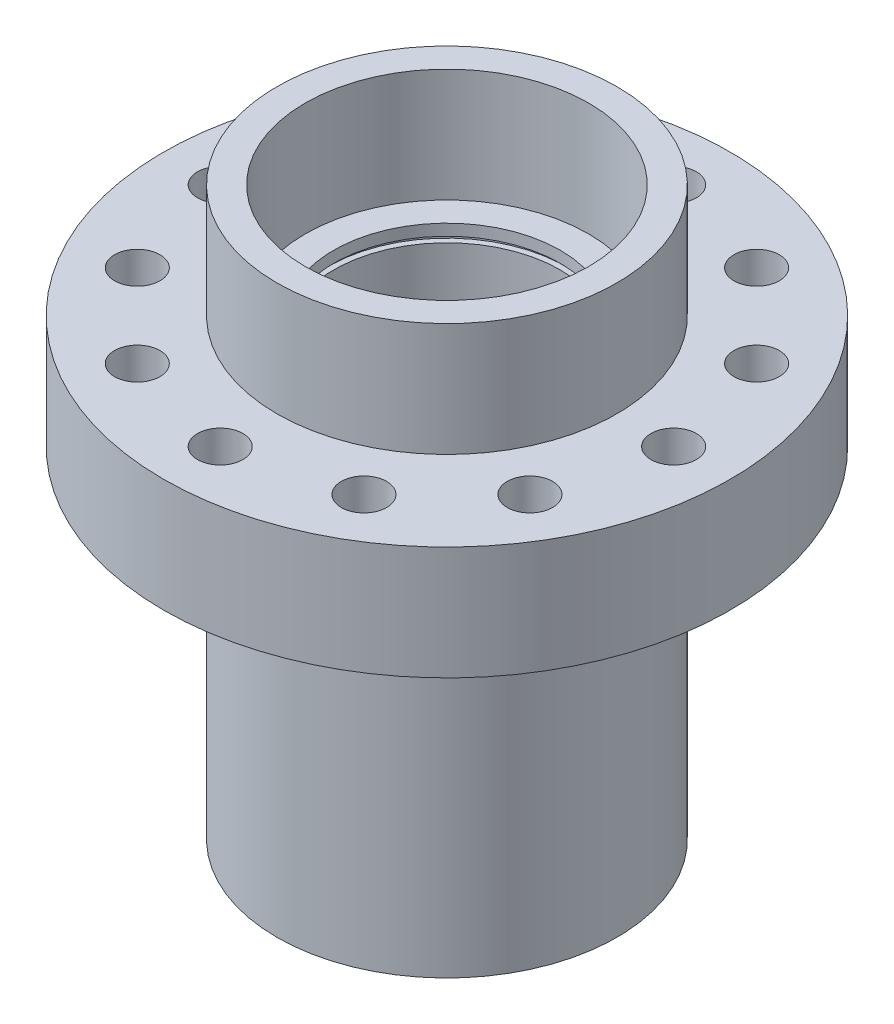
ISO-10303-21;
HEADER;
FILE_DESCRIPTION(('STEP AP214'),'2;1');
FILE_NAME('part.step','',(''),(''),'','','');
FILE_SCHEMA(('AUTOMOTIVE_DESIGN { 1 0 10303 214 1 1 1 1 }'));
ENDSEC;
DATA;
#1=APPLICATION_CONTEXT('core data for automotive mechanical design processes');
#2=APPLICATION_PROTOCOL_DEFINITION('international standard','automotive_design',2000,#1);
#3=PRODUCT_CONTEXT('',#1,'mechanical');
#4=PRODUCT('Part','Part','',(#3));
#5=PRODUCT_RELATED_PRODUCT_CATEGORY('part','',(#4));
#6=PRODUCT_DEFINITION_FORMATION('','',#4);
#7=PRODUCT_DEFINITION_CONTEXT('part definition',#1,'design');
#8=PRODUCT_DEFINITION('design','',#6,#7);
#9=PRODUCT_DEFINITION_SHAPE('','',#8);
#10=(LENGTH_UNIT() NAMED_UNIT(*) SI_UNIT(.MILLI.,.METRE.));
#11=(NAMED_UNIT(*) PLANE_ANGLE_UNIT() SI_UNIT($,.RADIAN.));
#12=(NAMED_UNIT(*) SI_UNIT($,.STERADIAN.) SOLID_ANGLE_UNIT());
#13=UNCERTAINTY_MEASURE_WITH_UNIT(LENGTH_MEASURE(1.E-05),#10,'distance_accuracy_value','');
#14=(GEOMETRIC_REPRESENTATION_CONTEXT(3) GLOBAL_UNCERTAINTY_ASSIGNED_CONTEXT((#13)) GLOBAL_UNIT_ASSIGNED_CONTEXT((#10,
#11,#12)) REPRESENTATION_CONTEXT('',''));
#15=CARTESIAN_POINT('',(0.,0.,0.));
#16=DIRECTION('',(0.,0.,1.));
#17=DIRECTION('',(1.,0.,0.));
#18=AXIS2_PLACEMENT_3D('',#15,#16,#17);
#19=CARTESIAN_POINT('',(0.,80.,0.));
#20=DIRECTION('',(0.,1.,0.));
#21=DIRECTION('',(0.,0.,1.));
#22=AXIS2_PLACEMENT_3D('',#19,#20,#21);
#23=PLANE('',#22);
#24=CARTESIAN_POINT('',(-19.9999999999993,80.,34.6410161513747));
#25=DIRECTION('',(0.,1.,0.));
#26=DIRECTION('',(0.,0.,1.));
#27=AXIS2_PLACEMENT_3D('',#24,#25,#26);
#28=CIRCLE('',#27,4.00000000000207);
#29=CARTESIAN_POINT('',(-19.9999999999993,80.,38.6410161513768));
#30=VERTEX_POINT('',#29);
#31=EDGE_CURVE('E167',#30,#30,#28,.F.);
#32=ORIENTED_EDGE('',*,*,#31,.T.);
#33=EDGE_LOOP('',(#32));
#34=FACE_BOUND('',#33,.T.);
#35=CARTESIAN_POINT('',(-34.6410161513747,80.,19.9999999999951));
#36=DIRECTION('',(0.,1.,0.));
#37=DIRECTION('',(0.,0.,1.));
#38=AXIS2_PLACEMENT_3D('',#35,#36,#37);
#39=CIRCLE('',#38,4.00000000000464);
#40=CARTESIAN_POINT('',(-34.6410161513747,80.,23.9999999999997));
#41=VERTEX_POINT('',#40);
#42=EDGE_CURVE('E161',#41,#41,#39,.F.);
#43=ORIENTED_EDGE('',*,*,#42,.T.);
#44=EDGE_LOOP('',(#43));
#45=FACE_BOUND('',#44,.T.);
#46=CARTESIAN_POINT('',(-39.9999999999943,80.,-5.6843418860808E-12));
#47=DIRECTION('',(0.,1.,0.));
#48=DIRECTION('',(0.,0.,1.));
#49=AXIS2_PLACEMENT_3D('',#46,#47,#48);
#50=CIRCLE('',#49,4.0000000000075);
#51=CARTESIAN_POINT('',(-39.9999999999943,80.,4.00000000000181));
#52=VERTEX_POINT('',#51);
#53=EDGE_CURVE('E155',#52,#52,#50,.F.);
#54=ORIENTED_EDGE('',*,*,#53,.T.);
#55=EDGE_LOOP('',(#54));
#56=FACE_BOUND('',#55,.T.);
#57=CARTESIAN_POINT('',(-34.641016151369,80.,-20.0000000000049));
#58=DIRECTION('',(0.,1.,0.));
#59=DIRECTION('',(0.,0.,1.));
#60=AXIS2_PLACEMENT_3D('',#57,#58,#59);
#61=CIRCLE('',#60,4.00000000000994);
#62=CARTESIAN_POINT('',(-34.641016151369,80.,-15.999999999995));
#63=VERTEX_POINT('',#62);
#64=EDGE_CURVE('E149',#63,#63,#61,.F.);
#65=ORIENTED_EDGE('',*,*,#64,.T.);
#66=EDGE_LOOP('',(#65));
#67=FACE_BOUND('',#66,.T.);
#68=CARTESIAN_POINT('',(-19.9999999999894,80.,-34.6410161513804));
#69=DIRECTION('',(0.,1.,0.));
#70=DIRECTION('',(0.,0.,1.));
#71=AXIS2_PLACEMENT_3D('',#68,#69,#70);
#72=CIRCLE('',#71,4.00000000001128);
#73=CARTESIAN_POINT('',(-19.9999999999894,80.,-30.6410161513691));
#74=VERTEX_POINT('',#73);
#75=EDGE_CURVE('E143',#74,#74,#72,.F.);
#76=ORIENTED_EDGE('',*,*,#75,.T.);
#77=EDGE_LOOP('',(#76));
#78=FACE_BOUND('',#77,.T.);
#79=CARTESIAN_POINT('',(1.13588865977684E-11,80.,-40.));
#80=DIRECTION('',(0.,1.,0.));
#81=DIRECTION('',(0.,0.,1.));
#82=AXIS2_PLACEMENT_3D('',#79,#80,#81);
#83=CIRCLE('',#82,4.00000000001113);
#84=CARTESIAN_POINT('',(1.13588865977684E-11,80.,-35.9999999999889));
#85=VERTEX_POINT('',#84);
#86=EDGE_CURVE('E137',#85,#85,#83,.F.);
#87=ORIENTED_EDGE('',*,*,#86,.T.);
#88=EDGE_LOOP('',(#87));
#89=FACE_BOUND('',#88,.T.);
#90=CARTESIAN_POINT('',(20.0000000000106,80.,-34.6410161513747));
#91=DIRECTION('',(0.,1.,0.));
#92=DIRECTION('',(0.,0.,1.));
#93=AXIS2_PLACEMENT_3D('',#90,#91,#92);
#94=CIRCLE('',#93,4.00000000000955);
#95=CARTESIAN_POINT('',(20.0000000000106,80.,-30.6410161513652));
#96=VERTEX_POINT('',#95);
#97=EDGE_CURVE('E131',#96,#96,#94,.F.);
#98=ORIENTED_EDGE('',*,*,#97,.T.);
#99=EDGE_LOOP('',(#98));
#100=FACE_BOUND('',#99,.T.);
#101=CARTESIAN_POINT('',(34.6410161513861,80.,-19.9999999999951));
#102=DIRECTION('',(0.,1.,0.));
#103=DIRECTION('',(0.,0.,1.));
#104=AXIS2_PLACEMENT_3D('',#101,#102,#103);
#105=CIRCLE('',#104,4.00000000000689);
#106=CARTESIAN_POINT('',(34.6410161513861,80.,-15.9999999999882));
#107=VERTEX_POINT('',#106);
#108=EDGE_CURVE('E125',#107,#107,#105,.F.);
#109=ORIENTED_EDGE('',*,*,#108,.T.);
#110=EDGE_LOOP('',(#109));
#111=FACE_BOUND('',#110,.T.);
#112=CARTESIAN_POINT('',(40.0000000000057,80.,5.67944329888421E-12));
#113=DIRECTION('',(0.,1.,0.));
#114=DIRECTION('',(0.,0.,1.));
#115=AXIS2_PLACEMENT_3D('',#112,#113,#114);
#116=CIRCLE('',#115,4.00000000000391);
#117=CARTESIAN_POINT('',(40.0000000000057,80.,4.00000000000959));
#118=VERTEX_POINT('',#117);
#119=EDGE_CURVE('E119',#118,#118,#116,.F.);
#120=ORIENTED_EDGE('',*,*,#119,.T.);
#121=EDGE_LOOP('',(#120));
#122=FACE_BOUND('',#121,.T.);
#123=CARTESIAN_POINT('',(34.6410161513804,80.,20.0000000000049));
#124=DIRECTION('',(0.,1.,0.));
#125=DIRECTION('',(0.,0.,1.));
#126=AXIS2_PLACEMENT_3D('',#123,#124,#125);
#127=CIRCLE('',#126,4.00000000000138);
#128=CARTESIAN_POINT('',(34.6410161513804,80.,24.0000000000063));
#129=VERTEX_POINT('',#128);
#130=EDGE_CURVE('E113',#129,#129,#127,.F.);
#131=ORIENTED_EDGE('',*,*,#130,.T.);
#132=EDGE_LOOP('',(#131));
#133=FACE_BOUND('',#132,.T.);
#134=CARTESIAN_POINT('',(20.0000000000008,80.,34.6410161513804));
#135=DIRECTION('',(0.,1.,0.));
#136=DIRECTION('',(0.,0.,1.));
#137=AXIS2_PLACEMENT_3D('',#134,#135,#136);
#138=CIRCLE('',#137,3.99999999999993);
#139=CARTESIAN_POINT('',(20.0000000000008,80.,38.6410161513803));
#140=VERTEX_POINT('',#139);
#141=EDGE_CURVE('E107',#140,#140,#138,.F.);
#142=ORIENTED_EDGE('',*,*,#141,.T.);
#143=EDGE_LOOP('',(#142));
#144=FACE_BOUND('',#143,.T.);
#145=CARTESIAN_POINT('',(0.,80.,40.));
#146=DIRECTION('',(0.,1.,0.));
#147=DIRECTION('',(0.,0.,1.));
#148=AXIS2_PLACEMENT_3D('',#145,#146,#147);
#149=CIRCLE('',#148,4.);
#150=CARTESIAN_POINT('',(0.,80.,44.));
#151=VERTEX_POINT('',#150);
#152=EDGE_CURVE('E101',#151,#151,#149,.F.);
#153=ORIENTED_EDGE('',*,*,#152,.T.);
#154=EDGE_LOOP('',(#153));
#155=FACE_BOUND('',#154,.T.);
#156=CARTESIAN_POINT('',(0.,80.,0.));
#157=DIRECTION('',(0.,1.,0.));
#158=DIRECTION('',(0.,0.,1.));
#159=AXIS2_PLACEMENT_3D('',#156,#157,#158);
#160=CIRCLE('',#159,50.);
#161=CARTESIAN_POINT('',(0.,80.,50.));
#162=VERTEX_POINT('',#161);
#163=EDGE_CURVE('E71',#162,#162,#160,.T.);
#164=ORIENTED_EDGE('',*,*,#163,.T.);
#165=EDGE_LOOP('',(#164));
#166=FACE_BOUND('',#165,.T.);
#167=CARTESIAN_POINT('',(0.,80.,0.));
#168=DIRECTION('',(0.,1.,0.));
#169=DIRECTION('',(0.,0.,1.));
#170=AXIS2_PLACEMENT_3D('',#167,#168,#169);
#171=CIRCLE('',#170,30.);
#172=CARTESIAN_POINT('',(0.,80.,30.));
#173=VERTEX_POINT('',#172);
#174=EDGE_CURVE('E174',#173,#173,#171,.T.);
#175=ORIENTED_EDGE('',*,*,#174,.F.);
#176=EDGE_LOOP('',(#175));
#177=FACE_BOUND('',#176,.T.);
#178=ADVANCED_FACE('F36',(#34,#45,#56,#67,#78,#89,#100,#111,#122,#133,#144,#155,#166,#177),#23,.T.);
#179=CARTESIAN_POINT('',(0.,80.,0.));
#180=DIRECTION('',(0.,1.,0.));
#181=DIRECTION('',(0.,0.,1.));
#182=AXIS2_PLACEMENT_3D('',#179,#180,#181);
#183=CYLINDRICAL_SURFACE('',#182,20.);
#184=CARTESIAN_POINT('',(0.,15.,0.));
#185=DIRECTION('',(0.,1.,0.));
#186=DIRECTION('',(0.,0.,1.));
#187=AXIS2_PLACEMENT_3D('',#184,#185,#186);
#188=CIRCLE('',#187,20.);
#189=CARTESIAN_POINT('',(0.,15.,20.));
#190=VERTEX_POINT('',#189);
#191=EDGE_CURVE('E98',#190,#190,#188,.T.);
#192=ORIENTED_EDGE('',*,*,#191,.T.);
#193=EDGE_LOOP('',(#192));
#194=FACE_BOUND('',#193,.T.);
#195=CARTESIAN_POINT('',(0.,3.,0.));
#196=DIRECTION('',(0.,1.,0.));
#197=DIRECTION('',(0.,0.,1.));
#198=AXIS2_PLACEMENT_3D('',#195,#196,#197);
#199=CIRCLE('',#198,20.);
#200=CARTESIAN_POINT('',(0.,3.,20.));
#201=VERTEX_POINT('',#200);
#202=EDGE_CURVE('E43',#201,#201,#199,.T.);
#203=ORIENTED_EDGE('',*,*,#202,.F.);
#204=EDGE_LOOP('',(#203));
#205=FACE_BOUND('',#204,.T.);
#206=ADVANCED_FACE('F38',(#194,#205),#183,.F.);
#207=CARTESIAN_POINT('',(0.,3.,0.));
#208=DIRECTION('',(0.,1.,0.));
#209=DIRECTION('',(0.,0.,1.));
#210=AXIS2_PLACEMENT_3D('',#207,#208,#209);
#211=PLANE('',#210);
#212=CARTESIAN_POINT('',(0.,3.,0.));
#213=DIRECTION('',(0.,1.,0.));
#214=DIRECTION('',(0.,0.,1.));
#215=AXIS2_PLACEMENT_3D('',#212,#213,#214);
#216=CIRCLE('',#215,21.);
#217=CARTESIAN_POINT('',(0.,3.,21.));
#218=VERTEX_POINT('',#217);
#219=EDGE_CURVE('E47',#218,#218,#216,.T.);
#220=ORIENTED_EDGE('',*,*,#219,.F.);
#221=EDGE_LOOP('',(#220));
#222=FACE_BOUND('',#221,.T.);
#223=ORIENTED_EDGE('',*,*,#202,.T.);
#224=EDGE_LOOP('',(#223));
#225=FACE_BOUND('',#224,.T.);
#226=ADVANCED_FACE('F208',(#222,#225),#211,.F.);
#227=CARTESIAN_POINT('',(0.,80.,0.));
#228=DIRECTION('',(0.,1.,0.));
#229=DIRECTION('',(0.,0.,1.));
#230=AXIS2_PLACEMENT_3D('',#227,#228,#229);
#231=CYLINDRICAL_SURFACE('',#230,21.);
#232=CARTESIAN_POINT('',(0.,2.,0.));
#233=DIRECTION('',(0.,1.,0.));
#234=DIRECTION('',(0.,0.,1.));
#235=AXIS2_PLACEMENT_3D('',#232,#233,#234);
#236=CIRCLE('',#235,21.);
#237=CARTESIAN_POINT('',(0.,2.,21.));
#238=VERTEX_POINT('',#237);
#239=EDGE_CURVE('E51',#238,#238,#236,.T.);
#240=ORIENTED_EDGE('',*,*,#239,.F.);
#241=EDGE_LOOP('',(#240));
#242=FACE_BOUND('',#241,.T.);
#243=ORIENTED_EDGE('',*,*,#219,.T.);
#244=EDGE_LOOP('',(#243));
#245=FACE_BOUND('',#244,.T.);
#246=ADVANCED_FACE('F250',(#242,#245),#231,.F.);
#247=CARTESIAN_POINT('',(0.,2.,0.));
#248=DIRECTION('',(0.,-1.,0.));
#249=DIRECTION('',(0.,0.,-1.));
#250=AXIS2_PLACEMENT_3D('',#247,#248,#249);
#251=PLANE('',#250);
#252=CARTESIAN_POINT('',(0.,2.,0.));
#253=DIRECTION('',(0.,1.,0.));
#254=DIRECTION('',(0.,0.,1.));
#255=AXIS2_PLACEMENT_3D('',#252,#253,#254);
#256=CIRCLE('',#255,20.);
#257=CARTESIAN_POINT('',(0.,2.,20.));
#258=VERTEX_POINT('',#257);
#259=EDGE_CURVE('E56',#258,#258,#256,.T.);
#260=ORIENTED_EDGE('',*,*,#259,.F.);
#261=EDGE_LOOP('',(#260));
#262=FACE_BOUND('',#261,.T.);
#263=ORIENTED_EDGE('',*,*,#239,.T.);
#264=EDGE_LOOP('',(#263));
#265=FACE_BOUND('',#264,.T.);
#266=ADVANCED_FACE('F246',(#262,#265),#251,.F.);
#267=CARTESIAN_POINT('',(0.,80.,0.));
#268=DIRECTION('',(0.,1.,0.));
#269=DIRECTION('',(0.,0.,1.));
#270=AXIS2_PLACEMENT_3D('',#267,#268,#269);
#271=CYLINDRICAL_SURFACE('',#270,20.);
#272=ORIENTED_EDGE('',*,*,#259,.T.);
#273=EDGE_LOOP('',(#272));
#274=FACE_BOUND('',#273,.T.);
#275=CARTESIAN_POINT('',(0.,0.,0.));
#276=DIRECTION('',(0.,1.,0.));
#277=DIRECTION('',(0.,0.,1.));
#278=AXIS2_PLACEMENT_3D('',#275,#276,#277);
#279=CIRCLE('',#278,20.);
#280=CARTESIAN_POINT('',(0.,0.,20.));
#281=VERTEX_POINT('',#280);
#282=EDGE_CURVE('E59',#281,#281,#279,.T.);
#283=ORIENTED_EDGE('',*,*,#282,.F.);
#284=EDGE_LOOP('',(#283));
#285=FACE_BOUND('',#284,.T.);
#286=ADVANCED_FACE('F242',(#274,#285),#271,.F.);
#287=CARTESIAN_POINT('',(0.,0.,0.));
#288=DIRECTION('',(0.,-1.,0.));
#289=DIRECTION('',(0.,0.,-1.));
#290=AXIS2_PLACEMENT_3D('',#287,#288,#289);
#291=PLANE('',#290);
#292=ORIENTED_EDGE('',*,*,#282,.T.);
#293=EDGE_LOOP('',(#292));
#294=FACE_BOUND('',#293,.T.);
#295=CARTESIAN_POINT('',(0.,0.,0.));
#296=DIRECTION('',(0.,1.,0.));
#297=DIRECTION('',(0.,0.,1.));
#298=AXIS2_PLACEMENT_3D('',#295,#296,#297);
#299=CIRCLE('',#298,30.);
#300=CARTESIAN_POINT('',(0.,0.,30.));
#301=VERTEX_POINT('',#300);
#302=EDGE_CURVE('E62',#301,#301,#299,.T.);
#303=ORIENTED_EDGE('',*,*,#302,.F.);
#304=EDGE_LOOP('',(#303));
#305=FACE_BOUND('',#304,.T.);
#306=ADVANCED_FACE('F238',(#294,#305),#291,.T.);
#307=CARTESIAN_POINT('',(0.,80.,0.));
#308=DIRECTION('',(0.,1.,0.));
#309=DIRECTION('',(0.,0.,1.));
#310=AXIS2_PLACEMENT_3D('',#307,#308,#309);
#311=CYLINDRICAL_SURFACE('',#310,30.);
#312=ORIENTED_EDGE('',*,*,#302,.T.);
#313=EDGE_LOOP('',(#312));
#314=FACE_BOUND('',#313,.T.);
#315=CARTESIAN_POINT('',(0.,60.,0.));
#316=DIRECTION('',(0.,1.,0.));
#317=DIRECTION('',(0.,0.,1.));
#318=AXIS2_PLACEMENT_3D('',#315,#316,#317);
#319=CIRCLE('',#318,30.);
#320=CARTESIAN_POINT('',(0.,60.,30.));
#321=VERTEX_POINT('',#320);
#322=EDGE_CURVE('E65',#321,#321,#319,.T.);
#323=ORIENTED_EDGE('',*,*,#322,.F.);
#324=EDGE_LOOP('',(#323));
#325=FACE_BOUND('',#324,.T.);
#326=ADVANCED_FACE('F231',(#314,#325),#311,.T.);
#327=CARTESIAN_POINT('',(0.,60.,0.));
#328=DIRECTION('',(0.,-1.,0.));
#329=DIRECTION('',(0.,0.,-1.));
#330=AXIS2_PLACEMENT_3D('',#327,#328,#329);
#331=PLANE('',#330);
#332=CARTESIAN_POINT('',(-19.9999999999993,60.,34.6410161513747));
#333=DIRECTION('',(0.,-1.,0.));
#334=DIRECTION('',(0.,0.,-1.));
#335=AXIS2_PLACEMENT_3D('',#332,#333,#334);
#336=CIRCLE('',#335,4.00000000000207);
#337=CARTESIAN_POINT('',(-19.9999999999993,60.,30.6410161513726));
#338=VERTEX_POINT('',#337);
#339=EDGE_CURVE('E170',#338,#338,#336,.T.);
#340=ORIENTED_EDGE('',*,*,#339,.F.);
#341=EDGE_LOOP('',(#340));
#342=FACE_BOUND('',#341,.T.);
#343=CARTESIAN_POINT('',(-34.6410161513747,60.,19.9999999999951));
#344=DIRECTION('',(0.,-1.,0.));
#345=DIRECTION('',(0.,0.,-1.));
#346=AXIS2_PLACEMENT_3D('',#343,#344,#345);
#347=CIRCLE('',#346,4.00000000000464);
#348=CARTESIAN_POINT('',(-34.6410161513747,60.,15.9999999999904));
#349=VERTEX_POINT('',#348);
#350=EDGE_CURVE('E164',#349,#349,#347,.T.);
#351=ORIENTED_EDGE('',*,*,#350,.F.);
#352=EDGE_LOOP('',(#351));
#353=FACE_BOUND('',#352,.T.);
#354=CARTESIAN_POINT('',(-39.9999999999943,60.,-5.6843418860808E-12));
#355=DIRECTION('',(0.,-1.,0.));
#356=DIRECTION('',(0.,0.,-1.));
#357=AXIS2_PLACEMENT_3D('',#354,#355,#356);
#358=CIRCLE('',#357,4.0000000000075);
#359=CARTESIAN_POINT('',(-39.9999999999943,60.,-4.00000000001318));
#360=VERTEX_POINT('',#359);
#361=EDGE_CURVE('E158',#360,#360,#358,.T.);
#362=ORIENTED_EDGE('',*,*,#361,.F.);
#363=EDGE_LOOP('',(#362));
#364=FACE_BOUND('',#363,.T.);
#365=CARTESIAN_POINT('',(-34.641016151369,60.,-20.0000000000049));
#366=DIRECTION('',(0.,-1.,0.));
#367=DIRECTION('',(0.,0.,-1.));
#368=AXIS2_PLACEMENT_3D('',#365,#366,#367);
#369=CIRCLE('',#368,4.00000000000994);
#370=CARTESIAN_POINT('',(-34.641016151369,60.,-24.0000000000149));
#371=VERTEX_POINT('',#370);
#372=EDGE_CURVE('E152',#371,#371,#369,.T.);
#373=ORIENTED_EDGE('',*,*,#372,.F.);
#374=EDGE_LOOP('',(#373));
#375=FACE_BOUND('',#374,.T.);
#376=CARTESIAN_POINT('',(-19.9999999999894,60.,-34.6410161513804));
#377=DIRECTION('',(0.,-1.,0.));
#378=DIRECTION('',(0.,0.,-1.));
#379=AXIS2_PLACEMENT_3D('',#376,#377,#378);
#380=CIRCLE('',#379,4.00000000001128);
#381=CARTESIAN_POINT('',(-19.9999999999894,60.,-38.6410161513917));
#382=VERTEX_POINT('',#381);
#383=EDGE_CURVE('E146',#382,#382,#380,.T.);
#384=ORIENTED_EDGE('',*,*,#383,.F.);
#385=EDGE_LOOP('',(#384));
#386=FACE_BOUND('',#385,.T.);
#387=CARTESIAN_POINT('',(1.13588865977684E-11,60.,-40.));
#388=DIRECTION('',(0.,-1.,0.));
#389=DIRECTION('',(0.,0.,-1.));
#390=AXIS2_PLACEMENT_3D('',#387,#388,#389);
#391=CIRCLE('',#390,4.00000000001113);
#392=CARTESIAN_POINT('',(1.13588865977684E-11,60.,-44.0000000000111));
#393=VERTEX_POINT('',#392);
#394=EDGE_CURVE('E140',#393,#393,#391,.T.);
#395=ORIENTED_EDGE('',*,*,#394,.F.);
#396=EDGE_LOOP('',(#395));
#397=FACE_BOUND('',#396,.T.);
#398=CARTESIAN_POINT('',(20.0000000000106,60.,-34.6410161513747));
#399=DIRECTION('',(0.,-1.,0.));
#400=DIRECTION('',(0.,0.,-1.));
#401=AXIS2_PLACEMENT_3D('',#398,#399,#400);
#402=CIRCLE('',#401,4.00000000000955);
#403=CARTESIAN_POINT('',(20.0000000000106,60.,-38.6410161513842));
#404=VERTEX_POINT('',#403);
#405=EDGE_CURVE('E134',#404,#404,#402,.T.);
#406=ORIENTED_EDGE('',*,*,#405,.F.);
#407=EDGE_LOOP('',(#406));
#408=FACE_BOUND('',#407,.T.);
#409=CARTESIAN_POINT('',(34.6410161513861,60.,-19.9999999999951));
#410=DIRECTION('',(0.,-1.,0.));
#411=DIRECTION('',(0.,0.,-1.));
#412=AXIS2_PLACEMENT_3D('',#409,#410,#411);
#413=CIRCLE('',#412,4.00000000000689);
#414=CARTESIAN_POINT('',(34.6410161513861,60.,-24.000000000002));
#415=VERTEX_POINT('',#414);
#416=EDGE_CURVE('E128',#415,#415,#413,.T.);
#417=ORIENTED_EDGE('',*,*,#416,.F.);
#418=EDGE_LOOP('',(#417));
#419=FACE_BOUND('',#418,.T.);
#420=CARTESIAN_POINT('',(40.0000000000057,60.,5.67944329888421E-12));
#421=DIRECTION('',(0.,-1.,0.));
#422=DIRECTION('',(0.,0.,-1.));
#423=AXIS2_PLACEMENT_3D('',#420,#421,#422);
#424=CIRCLE('',#423,4.00000000000391);
#425=CARTESIAN_POINT('',(40.0000000000057,60.,-3.99999999999823));
#426=VERTEX_POINT('',#425);
#427=EDGE_CURVE('E122',#426,#426,#424,.T.);
#428=ORIENTED_EDGE('',*,*,#427,.F.);
#429=EDGE_LOOP('',(#428));
#430=FACE_BOUND('',#429,.T.);
#431=CARTESIAN_POINT('',(34.6410161513804,60.,20.0000000000049));
#432=DIRECTION('',(0.,-1.,0.));
#433=DIRECTION('',(0.,0.,-1.));
#434=AXIS2_PLACEMENT_3D('',#431,#432,#433);
#435=CIRCLE('',#434,4.00000000000138);
#436=CARTESIAN_POINT('',(34.6410161513804,60.,16.0000000000035));
#437=VERTEX_POINT('',#436);
#438=EDGE_CURVE('E116',#437,#437,#435,.T.);
#439=ORIENTED_EDGE('',*,*,#438,.F.);
#440=EDGE_LOOP('',(#439));
#441=FACE_BOUND('',#440,.T.);
#442=CARTESIAN_POINT('',(20.0000000000008,60.,34.6410161513804));
#443=DIRECTION('',(0.,-1.,0.));
#444=DIRECTION('',(0.,0.,-1.));
#445=AXIS2_PLACEMENT_3D('',#442,#443,#444);
#446=CIRCLE('',#445,3.99999999999993);
#447=CARTESIAN_POINT('',(20.0000000000008,60.,30.6410161513804));
#448=VERTEX_POINT('',#447);
#449=EDGE_CURVE('E110',#448,#448,#446,.T.);
#450=ORIENTED_EDGE('',*,*,#449,.F.);
#451=EDGE_LOOP('',(#450));
#452=FACE_BOUND('',#451,.T.);
#453=CARTESIAN_POINT('',(0.,60.,40.));
#454=DIRECTION('',(0.,-1.,0.));
#455=DIRECTION('',(0.,0.,-1.));
#456=AXIS2_PLACEMENT_3D('',#453,#454,#455);
#457=CIRCLE('',#456,4.);
#458=CARTESIAN_POINT('',(0.,60.,36.));
#459=VERTEX_POINT('',#458);
#460=EDGE_CURVE('E104',#459,#459,#457,.T.);
#461=ORIENTED_EDGE('',*,*,#460,.F.);
#462=EDGE_LOOP('',(#461));
#463=FACE_BOUND('',#462,.T.);
#464=ORIENTED_EDGE('',*,*,#322,.T.);
#465=EDGE_LOOP('',(#464));
#466=FACE_BOUND('',#465,.T.);
#467=CARTESIAN_POINT('',(0.,60.,0.));
#468=DIRECTION('',(0.,1.,0.));
#469=DIRECTION('',(0.,0.,1.));
#470=AXIS2_PLACEMENT_3D('',#467,#468,#469);
#471=CIRCLE('',#470,50.);
#472=CARTESIAN_POINT('',(0.,60.,50.));
#473=VERTEX_POINT('',#472);
#474=EDGE_CURVE('E68',#473,#473,#471,.T.);
#475=ORIENTED_EDGE('',*,*,#474,.F.);
#476=EDGE_LOOP('',(#475));
#477=FACE_BOUND('',#476,.T.);
#478=ADVANCED_FACE('F223',(#342,#353,#364,#375,#386,#397,#408,#419,#430,#441,#452,#463,#466,
#477),#331,.T.);
#479=CARTESIAN_POINT('',(0.,80.,0.));
#480=DIRECTION('',(0.,1.,0.));
#481=DIRECTION('',(0.,0.,1.));
#482=AXIS2_PLACEMENT_3D('',#479,#480,#481);
#483=CYLINDRICAL_SURFACE('',#482,50.);
#484=ORIENTED_EDGE('',*,*,#474,.T.);
#485=EDGE_LOOP('',(#484));
#486=FACE_BOUND('',#485,.T.);
#487=ORIENTED_EDGE('',*,*,#163,.F.);
#488=EDGE_LOOP('',(#487));
#489=FACE_BOUND('',#488,.T.);
#490=ADVANCED_FACE('F215',(#486,#489),#483,.T.);
#491=CARTESIAN_POINT('',(0.,80.,0.));
#492=DIRECTION('',(0.,1.,0.));
#493=DIRECTION('',(0.,0.,1.));
#494=AXIS2_PLACEMENT_3D('',#491,#492,#493);
#495=CIRCLE('',#494,25.);
#496=CARTESIAN_POINT('',(0.,80.,25.));
#497=VERTEX_POINT('',#496);
#498=EDGE_CURVE('E11',#497,#497,#495,.F.);
#499=ORIENTED_EDGE('',*,*,#498,.F.);
#500=EDGE_LOOP('',(#499));
#501=FACE_BOUND('',#500,.T.);
#502=CARTESIAN_POINT('',(0.,80.,0.));
#503=DIRECTION('',(0.,1.,0.));
#504=DIRECTION('',(0.,0.,1.));
#505=AXIS2_PLACEMENT_3D('',#502,#503,#504);
#506=CIRCLE('',#505,20.);
#507=CARTESIAN_POINT('',(0.,80.,20.));
#508=VERTEX_POINT('',#507);
#509=EDGE_CURVE('E74',#508,#508,#506,.T.);
#510=ORIENTED_EDGE('',*,*,#509,.F.);
#511=EDGE_LOOP('',(#510));
#512=FACE_BOUND('',#511,.T.);
#513=ADVANCED_FACE('F204',(#501,#512),#23,.T.);
#514=CARTESIAN_POINT('',(0.,80.,0.));
#515=DIRECTION('',(0.,1.,0.));
#516=DIRECTION('',(0.,0.,1.));
#517=AXIS2_PLACEMENT_3D('',#514,#515,#516);
#518=CYLINDRICAL_SURFACE('',#517,20.);
#519=CARTESIAN_POINT('',(0.,78.,0.));
#520=DIRECTION('',(0.,1.,0.));
#521=DIRECTION('',(0.,0.,1.));
#522=AXIS2_PLACEMENT_3D('',#519,#520,#521);
#523=CIRCLE('',#522,20.);
#524=CARTESIAN_POINT('',(0.,78.,20.));
#525=VERTEX_POINT('',#524);
#526=EDGE_CURVE('E77',#525,#525,#523,.T.);
#527=ORIENTED_EDGE('',*,*,#526,.F.);
#528=EDGE_LOOP('',(#527));
#529=FACE_BOUND('',#528,.T.);
#530=ORIENTED_EDGE('',*,*,#509,.T.);
#531=EDGE_LOOP('',(#530));
#532=FACE_BOUND('',#531,.T.);
#533=ADVANCED_FACE('F214',(#529,#532),#518,.F.);
#534=CARTESIAN_POINT('',(0.,78.,0.));
#535=DIRECTION('',(0.,-1.,0.));
#536=DIRECTION('',(0.,0.,-1.));
#537=AXIS2_PLACEMENT_3D('',#534,#535,#536);
#538=PLANE('',#537);
#539=ORIENTED_EDGE('',*,*,#526,.T.);
#540=EDGE_LOOP('',(#539));
#541=FACE_BOUND('',#540,.T.);
#542=CARTESIAN_POINT('',(0.,78.,0.));
#543=DIRECTION('',(0.,1.,0.));
#544=DIRECTION('',(0.,0.,1.));
#545=AXIS2_PLACEMENT_3D('',#542,#543,#544);
#546=CIRCLE('',#545,21.);
#547=CARTESIAN_POINT('',(0.,78.,21.));
#548=VERTEX_POINT('',#547);
#549=EDGE_CURVE('E80',#548,#548,#546,.T.);
#550=ORIENTED_EDGE('',*,*,#549,.F.);
#551=EDGE_LOOP('',(#550));
#552=FACE_BOUND('',#551,.T.);
#553=ADVANCED_FACE('F221',(#541,#552),#538,.T.);
#554=CARTESIAN_POINT('',(0.,80.,0.));
#555=DIRECTION('',(0.,1.,0.));
#556=DIRECTION('',(0.,0.,1.));
#557=AXIS2_PLACEMENT_3D('',#554,#555,#556);
#558=CYLINDRICAL_SURFACE('',#557,21.);
#559=ORIENTED_EDGE('',*,*,#549,.T.);
#560=EDGE_LOOP('',(#559));
#561=FACE_BOUND('',#560,.T.);
#562=CARTESIAN_POINT('',(0.,77.,0.));
#563=DIRECTION('',(0.,1.,0.));
#564=DIRECTION('',(0.,0.,1.));
#565=AXIS2_PLACEMENT_3D('',#562,#563,#564);
#566=CIRCLE('',#565,21.);
#567=CARTESIAN_POINT('',(0.,77.,21.));
#568=VERTEX_POINT('',#567);
#569=EDGE_CURVE('E83',#568,#568,#566,.T.);
#570=ORIENTED_EDGE('',*,*,#569,.F.);
#571=EDGE_LOOP('',(#570));
#572=FACE_BOUND('',#571,.T.);
#573=ADVANCED_FACE('F450',(#561,#572),#558,.F.);
#574=CARTESIAN_POINT('',(0.,77.,0.));
#575=DIRECTION('',(0.,1.,0.));
#576=DIRECTION('',(0.,0.,1.));
#577=AXIS2_PLACEMENT_3D('',#574,#575,#576);
#578=PLANE('',#577);
#579=ORIENTED_EDGE('',*,*,#569,.T.);
#580=EDGE_LOOP('',(#579));
#581=FACE_BOUND('',#580,.T.);
#582=CARTESIAN_POINT('',(0.,77.,0.));
#583=DIRECTION('',(0.,1.,0.));
#584=DIRECTION('',(0.,0.,1.));
#585=AXIS2_PLACEMENT_3D('',#582,#583,#584);
#586=CIRCLE('',#585,20.);
#587=CARTESIAN_POINT('',(0.,77.,20.));
#588=VERTEX_POINT('',#587);
#589=EDGE_CURVE('E86',#588,#588,#586,.T.);
#590=ORIENTED_EDGE('',*,*,#589,.F.);
#591=EDGE_LOOP('',(#590));
#592=FACE_BOUND('',#591,.T.);
#593=ADVANCED_FACE('F459',(#581,#592),#578,.T.);
#594=CARTESIAN_POINT('',(0.,80.,0.));
#595=DIRECTION('',(0.,1.,0.));
#596=DIRECTION('',(0.,0.,1.));
#597=AXIS2_PLACEMENT_3D('',#594,#595,#596);
#598=CYLINDRICAL_SURFACE('',#597,20.);
#599=CARTESIAN_POINT('',(0.,65.,0.));
#600=DIRECTION('',(0.,1.,0.));
#601=DIRECTION('',(0.,0.,1.));
#602=AXIS2_PLACEMENT_3D('',#599,#600,#601);
#603=CIRCLE('',#602,20.);
#604=CARTESIAN_POINT('',(0.,65.,20.));
#605=VERTEX_POINT('',#604);
#606=EDGE_CURVE('E89',#605,#605,#603,.T.);
#607=ORIENTED_EDGE('',*,*,#606,.F.);
#608=EDGE_LOOP('',(#607));
#609=FACE_BOUND('',#608,.T.);
#610=ORIENTED_EDGE('',*,*,#589,.T.);
#611=EDGE_LOOP('',(#610));
#612=FACE_BOUND('',#611,.T.);
#613=ADVANCED_FACE('F468',(#609,#612),#598,.F.);
#614=CARTESIAN_POINT('',(0.,65.,0.));
#615=DIRECTION('',(0.,-1.,0.));
#616=DIRECTION('',(0.,0.,-1.));
#617=AXIS2_PLACEMENT_3D('',#614,#615,#616);
#618=PLANE('',#617);
#619=CARTESIAN_POINT('',(0.,65.,0.));
#620=DIRECTION('',(0.,1.,0.));
#621=DIRECTION('',(0.,0.,1.));
#622=AXIS2_PLACEMENT_3D('',#619,#620,#621);
#623=CIRCLE('',#622,10.);
#624=CARTESIAN_POINT('',(0.,65.,10.));
#625=VERTEX_POINT('',#624);
#626=EDGE_CURVE('E92',#625,#625,#623,.T.);
#627=ORIENTED_EDGE('',*,*,#626,.F.);
#628=EDGE_LOOP('',(#627));
#629=FACE_BOUND('',#628,.T.);
#630=ORIENTED_EDGE('',*,*,#606,.T.);
#631=EDGE_LOOP('',(#630));
#632=FACE_BOUND('',#631,.T.);
#633=ADVANCED_FACE('F477',(#629,#632),#618,.F.);
#634=CARTESIAN_POINT('',(0.,80.,0.));
#635=DIRECTION('',(0.,1.,0.));
#636=DIRECTION('',(0.,0.,1.));
#637=AXIS2_PLACEMENT_3D('',#634,#635,#636);
#638=CYLINDRICAL_SURFACE('',#637,10.);
#639=CARTESIAN_POINT('',(0.,15.,0.));
#640=DIRECTION('',(0.,1.,0.));
#641=DIRECTION('',(0.,0.,1.));
#642=AXIS2_PLACEMENT_3D('',#639,#640,#641);
#643=CIRCLE('',#642,10.);
#644=CARTESIAN_POINT('',(0.,15.,10.));
#645=VERTEX_POINT('',#644);
#646=EDGE_CURVE('E95',#645,#645,#643,.T.);
#647=ORIENTED_EDGE('',*,*,#646,.F.);
#648=EDGE_LOOP('',(#647));
#649=FACE_BOUND('',#648,.T.);
#650=ORIENTED_EDGE('',*,*,#626,.T.);
#651=EDGE_LOOP('',(#650));
#652=FACE_BOUND('',#651,.T.);
#653=ADVANCED_FACE('F486',(#649,#652),#638,.F.);
#654=CARTESIAN_POINT('',(0.,15.,0.));
#655=DIRECTION('',(0.,-1.,0.));
#656=DIRECTION('',(0.,0.,-1.));
#657=AXIS2_PLACEMENT_3D('',#654,#655,#656);
#658=PLANE('',#657);
#659=ORIENTED_EDGE('',*,*,#646,.T.);
#660=EDGE_LOOP('',(#659));
#661=FACE_BOUND('',#660,.T.);
#662=ORIENTED_EDGE('',*,*,#191,.F.);
#663=EDGE_LOOP('',(#662));
#664=FACE_BOUND('',#663,.T.);
#665=ADVANCED_FACE('F293',(#661,#664),#658,.T.);
#666=CARTESIAN_POINT('',(0.,91.3137084990167,40.));
#667=DIRECTION('',(0.,-1.,0.));
#668=DIRECTION('',(0.,0.,-1.));
#669=AXIS2_PLACEMENT_3D('',#666,#667,#668);
#670=CYLINDRICAL_SURFACE('',#669,4.);
#671=ORIENTED_EDGE('',*,*,#460,.T.);
#672=EDGE_LOOP('',(#671));
#673=FACE_BOUND('',#672,.T.);
#674=ORIENTED_EDGE('',*,*,#152,.F.);
#675=EDGE_LOOP('',(#674));
#676=FACE_BOUND('',#675,.T.);
#677=ADVANCED_FACE('F298',(#673,#676),#670,.F.);
#678=CARTESIAN_POINT('',(20.0000000000008,91.3137084990167,34.6410161513804));
#679=DIRECTION('',(0.,-1.,0.));
#680=DIRECTION('',(0.,0.,-1.));
#681=AXIS2_PLACEMENT_3D('',#678,#679,#680);
#682=CYLINDRICAL_SURFACE('',#681,3.99999999999993);
#683=ORIENTED_EDGE('',*,*,#449,.T.);
#684=EDGE_LOOP('',(#683));
#685=FACE_BOUND('',#684,.T.);
#686=ORIENTED_EDGE('',*,*,#141,.F.);
#687=EDGE_LOOP('',(#686));
#688=FACE_BOUND('',#687,.T.);
#689=ADVANCED_FACE('F303',(#685,#688),#682,.F.);
#690=CARTESIAN_POINT('',(34.6410161513804,91.3137084990167,20.0000000000049));
#691=DIRECTION('',(0.,-1.,0.));
#692=DIRECTION('',(0.,0.,-1.));
#693=AXIS2_PLACEMENT_3D('',#690,#691,#692);
#694=CYLINDRICAL_SURFACE('',#693,4.00000000000138);
#695=ORIENTED_EDGE('',*,*,#438,.T.);
#696=EDGE_LOOP('',(#695));
#697=FACE_BOUND('',#696,.T.);
#698=ORIENTED_EDGE('',*,*,#130,.F.);
#699=EDGE_LOOP('',(#698));
#700=FACE_BOUND('',#699,.T.);
#701=ADVANCED_FACE('F313',(#697,#700),#694,.F.);
#702=CARTESIAN_POINT('',(40.0000000000057,91.3137084990167,5.67944329888421E-12));
#703=DIRECTION('',(0.,-1.,0.));
#704=DIRECTION('',(0.,0.,-1.));
#705=AXIS2_PLACEMENT_3D('',#702,#703,#704);
#706=CYLINDRICAL_SURFACE('',#705,4.00000000000391);
#707=ORIENTED_EDGE('',*,*,#427,.T.);
#708=EDGE_LOOP('',(#707));
#709=FACE_BOUND('',#708,.T.);
#710=ORIENTED_EDGE('',*,*,#119,.F.);
#711=EDGE_LOOP('',(#710));
#712=FACE_BOUND('',#711,.T.);
#713=ADVANCED_FACE('F323',(#709,#712),#706,.F.);
#714=CARTESIAN_POINT('',(34.6410161513861,91.3137084990167,-19.9999999999951));
#715=DIRECTION('',(0.,-1.,0.));
#716=DIRECTION('',(0.,0.,-1.));
#717=AXIS2_PLACEMENT_3D('',#714,#715,#716);
#718=CYLINDRICAL_SURFACE('',#717,4.00000000000689);
#719=ORIENTED_EDGE('',*,*,#416,.T.);
#720=EDGE_LOOP('',(#719));
#721=FACE_BOUND('',#720,.T.);
#722=ORIENTED_EDGE('',*,*,#108,.F.);
#723=EDGE_LOOP('',(#722));
#724=FACE_BOUND('',#723,.T.);
#725=ADVANCED_FACE('F333',(#721,#724),#718,.F.);
#726=CARTESIAN_POINT('',(20.0000000000106,91.3137084990167,-34.6410161513747));
#727=DIRECTION('',(0.,-1.,0.));
#728=DIRECTION('',(0.,0.,-1.));
#729=AXIS2_PLACEMENT_3D('',#726,#727,#728);
#730=CYLINDRICAL_SURFACE('',#729,4.00000000000955);
#731=ORIENTED_EDGE('',*,*,#405,.T.);
#732=EDGE_LOOP('',(#731));
#733=FACE_BOUND('',#732,.T.);
#734=ORIENTED_EDGE('',*,*,#97,.F.);
#735=EDGE_LOOP('',(#734));
#736=FACE_BOUND('',#735,.T.);
#737=ADVANCED_FACE('F343',(#733,#736),#730,.F.);
#738=CARTESIAN_POINT('',(1.13588865977684E-11,91.3137084990167,-40.));
#739=DIRECTION('',(0.,-1.,0.));
#740=DIRECTION('',(0.,0.,-1.));
#741=AXIS2_PLACEMENT_3D('',#738,#739,#740);
#742=CYLINDRICAL_SURFACE('',#741,4.00000000001113);
#743=ORIENTED_EDGE('',*,*,#394,.T.);
#744=EDGE_LOOP('',(#743));
#745=FACE_BOUND('',#744,.T.);
#746=ORIENTED_EDGE('',*,*,#86,.F.);
#747=EDGE_LOOP('',(#746));
#748=FACE_BOUND('',#747,.T.);
#749=ADVANCED_FACE('F353',(#745,#748),#742,.F.);
#750=CARTESIAN_POINT('',(-19.9999999999894,91.3137084990167,-34.6410161513804));
#751=DIRECTION('',(0.,-1.,0.));
#752=DIRECTION('',(0.,0.,-1.));
#753=AXIS2_PLACEMENT_3D('',#750,#751,#752);
#754=CYLINDRICAL_SURFACE('',#753,4.00000000001128);
#755=ORIENTED_EDGE('',*,*,#383,.T.);
#756=EDGE_LOOP('',(#755));
#757=FACE_BOUND('',#756,.T.);
#758=ORIENTED_EDGE('',*,*,#75,.F.);
#759=EDGE_LOOP('',(#758));
#760=FACE_BOUND('',#759,.T.);
#761=ADVANCED_FACE('F363',(#757,#760),#754,.F.);
#762=CARTESIAN_POINT('',(-34.641016151369,91.3137084990167,-20.0000000000049));
#763=DIRECTION('',(0.,-1.,0.));
#764=DIRECTION('',(0.,0.,-1.));
#765=AXIS2_PLACEMENT_3D('',#762,#763,#764);
#766=CYLINDRICAL_SURFACE('',#765,4.00000000000994);
#767=ORIENTED_EDGE('',*,*,#372,.T.);
#768=EDGE_LOOP('',(#767));
#769=FACE_BOUND('',#768,.T.);
#770=ORIENTED_EDGE('',*,*,#64,.F.);
#771=EDGE_LOOP('',(#770));
#772=FACE_BOUND('',#771,.T.);
#773=ADVANCED_FACE('F373',(#769,#772),#766,.F.);
#774=CARTESIAN_POINT('',(-39.9999999999943,91.3137084990167,-5.6843418860808E-12));
#775=DIRECTION('',(0.,-1.,0.));
#776=DIRECTION('',(0.,0.,-1.));
#777=AXIS2_PLACEMENT_3D('',#774,#775,#776);
#778=CYLINDRICAL_SURFACE('',#777,4.0000000000075);
#779=ORIENTED_EDGE('',*,*,#361,.T.);
#780=EDGE_LOOP('',(#779));
#781=FACE_BOUND('',#780,.T.);
#782=ORIENTED_EDGE('',*,*,#53,.F.);
#783=EDGE_LOOP('',(#782));
#784=FACE_BOUND('',#783,.T.);
#785=ADVANCED_FACE('F383',(#781,#784),#778,.F.);
#786=CARTESIAN_POINT('',(-34.6410161513747,91.3137084990167,19.9999999999951));
#787=DIRECTION('',(0.,-1.,0.));
#788=DIRECTION('',(0.,0.,-1.));
#789=AXIS2_PLACEMENT_3D('',#786,#787,#788);
#790=CYLINDRICAL_SURFACE('',#789,4.00000000000464);
#791=ORIENTED_EDGE('',*,*,#350,.T.);
#792=EDGE_LOOP('',(#791));
#793=FACE_BOUND('',#792,.T.);
#794=ORIENTED_EDGE('',*,*,#42,.F.);
#795=EDGE_LOOP('',(#794));
#796=FACE_BOUND('',#795,.T.);
#797=ADVANCED_FACE('F197',(#793,#796),#790,.F.);
#798=CARTESIAN_POINT('',(-19.9999999999993,91.3137084990167,34.6410161513747));
#799=DIRECTION('',(0.,-1.,0.));
#800=DIRECTION('',(0.,0.,-1.));
#801=AXIS2_PLACEMENT_3D('',#798,#799,#800);
#802=CYLINDRICAL_SURFACE('',#801,4.00000000000207);
#803=ORIENTED_EDGE('',*,*,#339,.T.);
#804=EDGE_LOOP('',(#803));
#805=FACE_BOUND('',#804,.T.);
#806=ORIENTED_EDGE('',*,*,#31,.F.);
#807=EDGE_LOOP('',(#806));
#808=FACE_BOUND('',#807,.T.);
#809=ADVANCED_FACE('F188',(#805,#808),#802,.F.);
#810=CARTESIAN_POINT('',(0.,100.,0.));
#811=DIRECTION('',(0.,1.,0.));
#812=DIRECTION('',(0.,0.,1.));
#813=AXIS2_PLACEMENT_3D('',#810,#811,#812);
#814=PLANE('',#813);
#815=CARTESIAN_POINT('',(0.,100.,0.));
#816=DIRECTION('',(0.,1.,0.));
#817=DIRECTION('',(0.,0.,1.));
#818=AXIS2_PLACEMENT_3D('',#815,#816,#817);
#819=CIRCLE('',#818,30.);
#820=CARTESIAN_POINT('',(0.,100.,30.));
#821=VERTEX_POINT('',#820);
#822=EDGE_CURVE('E173',#821,#821,#819,.T.);
#823=ORIENTED_EDGE('',*,*,#822,.T.);
#824=EDGE_LOOP('',(#823));
#825=FACE_BOUND('',#824,.T.);
#826=CARTESIAN_POINT('',(0.,100.,0.));
#827=DIRECTION('',(0.,1.,0.));
#828=DIRECTION('',(1.,0.,0.));
#829=AXIS2_PLACEMENT_3D('',#826,#827,#828);
#830=CIRCLE('',#829,25.);
#831=CARTESIAN_POINT('',(25.,100.,0.));
#832=VERTEX_POINT('',#831);
#833=EDGE_CURVE('E177',#832,#832,#830,.T.);
#834=ORIENTED_EDGE('',*,*,#833,.F.);
#835=EDGE_LOOP('',(#834));
#836=FACE_BOUND('',#835,.T.);
#837=ADVANCED_FACE('F185',(#825,#836),#814,.T.);
#838=CARTESIAN_POINT('',(0.,100.,0.));
#839=DIRECTION('',(0.,-1.,0.));
#840=DIRECTION('',(0.,0.,-1.));
#841=AXIS2_PLACEMENT_3D('',#838,#839,#840);
#842=CYLINDRICAL_SURFACE('',#841,30.);
#843=ORIENTED_EDGE('',*,*,#822,.F.);
#844=EDGE_LOOP('',(#843));
#845=FACE_BOUND('',#844,.T.);
#846=ORIENTED_EDGE('',*,*,#174,.T.);
#847=EDGE_LOOP('',(#846));
#848=FACE_BOUND('',#847,.T.);
#849=ADVANCED_FACE('F187',(#845,#848),#842,.T.);
#850=CARTESIAN_POINT('',(0.,100.,0.));
#851=DIRECTION('',(0.,-1.,0.));
#852=DIRECTION('',(0.,0.,-1.));
#853=AXIS2_PLACEMENT_3D('',#850,#851,#852);
#854=CYLINDRICAL_SURFACE('',#853,25.);
#855=ORIENTED_EDGE('',*,*,#833,.T.);
#856=EDGE_LOOP('',(#855));
#857=FACE_BOUND('',#856,.T.);
#858=ORIENTED_EDGE('',*,*,#498,.T.);
#859=EDGE_LOOP('',(#858));
#860=FACE_BOUND('',#859,.T.);
#861=ADVANCED_FACE('F183',(#857,#860),#854,.F.);
#862=CLOSED_SHELL('',(#178,#206,#226,#246,#266,#286,#306,#326,#478,#490,#513,#533,#553,#573,
#593,#613,#633,#653,#665,#677,#689,#701,#713,#725,#737,#749,#761,#773,#785,#797,#809,#837,#849,#861));
#863=MANIFOLD_SOLID_BREP('B2',#862);
#864=ADVANCED_BREP_SHAPE_REPRESENTATION('',(#18,#863),#14);
#865=SHAPE_DEFINITION_REPRESENTATION(#9,#864);
ENDSEC;
END-ISO-10303-21;
